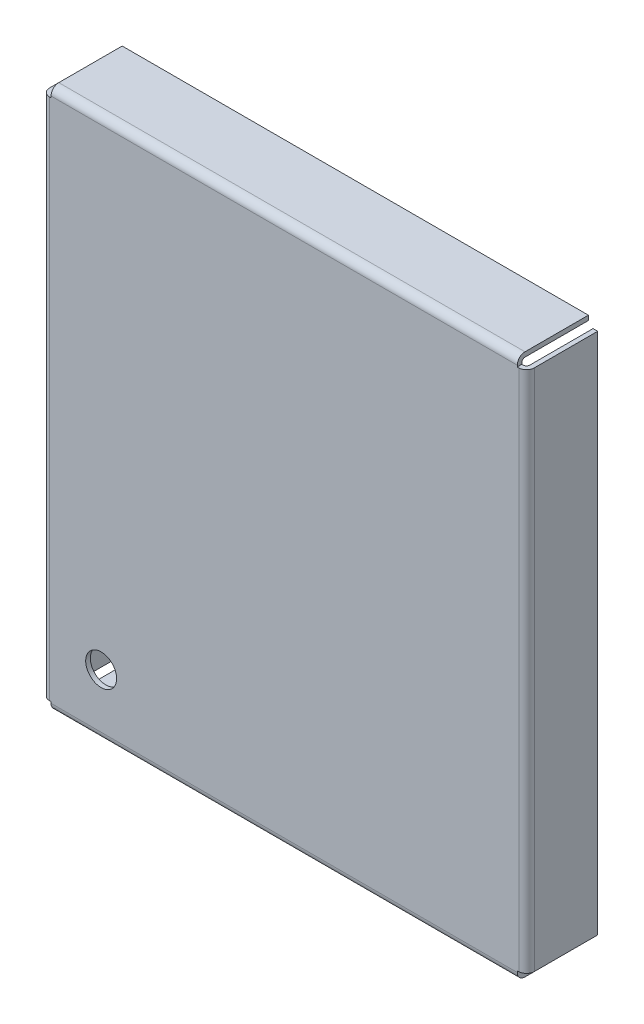
ISO-10303-21;
HEADER;
FILE_DESCRIPTION(('STEP AP214'),'2;1');
FILE_NAME('part.step','',(''),(''),'','','');
FILE_SCHEMA(('AUTOMOTIVE_DESIGN { 1 0 10303 214 1 1 1 1 }'));
ENDSEC;
DATA;
#1=APPLICATION_CONTEXT('core data for automotive mechanical design processes');
#2=APPLICATION_PROTOCOL_DEFINITION('international standard','automotive_design',2000,#1);
#3=PRODUCT_CONTEXT('',#1,'mechanical');
#4=PRODUCT('Part','Part','',(#3));
#5=PRODUCT_RELATED_PRODUCT_CATEGORY('part','',(#4));
#6=PRODUCT_DEFINITION_FORMATION('','',#4);
#7=PRODUCT_DEFINITION_CONTEXT('part definition',#1,'design');
#8=PRODUCT_DEFINITION('design','',#6,#7);
#9=PRODUCT_DEFINITION_SHAPE('','',#8);
#10=(LENGTH_UNIT() NAMED_UNIT(*) SI_UNIT(.MILLI.,.METRE.));
#11=(NAMED_UNIT(*) PLANE_ANGLE_UNIT() SI_UNIT($,.RADIAN.));
#12=(NAMED_UNIT(*) SI_UNIT($,.STERADIAN.) SOLID_ANGLE_UNIT());
#13=UNCERTAINTY_MEASURE_WITH_UNIT(LENGTH_MEASURE(1.E-05),#10,'distance_accuracy_value','');
#14=(GEOMETRIC_REPRESENTATION_CONTEXT(3) GLOBAL_UNCERTAINTY_ASSIGNED_CONTEXT((#13)) GLOBAL_UNIT_ASSIGNED_CONTEXT((#10,
#11,#12)) REPRESENTATION_CONTEXT('',''));
#15=CARTESIAN_POINT('',(0.,0.,0.));
#16=DIRECTION('',(0.,0.,1.));
#17=DIRECTION('',(1.,0.,0.));
#18=AXIS2_PLACEMENT_3D('',#15,#16,#17);
#19=CARTESIAN_POINT('',(-7.6,-8.35,0.));
#20=DIRECTION('',(-1.,0.,0.));
#21=DIRECTION('',(0.,0.,1.));
#22=AXIS2_PLACEMENT_3D('',#19,#20,#21);
#23=PLANE('',#22);
#24=DIRECTION('',(0.,0.,1.));
#25=VECTOR('',#24,1.);
#26=CARTESIAN_POINT('',(-7.6,-8.2,0.));
#27=LINE('',#26,#25);
#28=CARTESIAN_POINT('',(-7.6,-8.2,2.05));
#29=VERTEX_POINT('',#28);
#30=CARTESIAN_POINT('',(-7.6,-8.2,0.));
#31=VERTEX_POINT('',#30);
#32=EDGE_CURVE('E148',#29,#31,#27,.F.);
#33=ORIENTED_EDGE('',*,*,#32,.T.);
#34=DIRECTION('',(0.,1.,0.));
#35=VECTOR('',#34,1.);
#36=CARTESIAN_POINT('',(-7.6,0.25,0.));
#37=LINE('',#36,#35);
#38=CARTESIAN_POINT('',(-7.6,8.7,0.));
#39=VERTEX_POINT('',#38);
#40=EDGE_CURVE('E147',#31,#39,#37,.T.);
#41=ORIENTED_EDGE('',*,*,#40,.T.);
#42=DIRECTION('',(0.,0.,-1.));
#43=VECTOR('',#42,1.);
#44=CARTESIAN_POINT('',(-7.6,8.7,0.));
#45=LINE('',#44,#43);
#46=CARTESIAN_POINT('',(-7.6,8.7,2.05));
#47=VERTEX_POINT('',#46);
#48=EDGE_CURVE('E139',#39,#47,#45,.F.);
#49=ORIENTED_EDGE('',*,*,#48,.T.);
#50=DIRECTION('',(0.,1.,0.));
#51=VECTOR('',#50,1.);
#52=CARTESIAN_POINT('',(-7.6,-8.2,2.05));
#53=LINE('',#52,#51);
#54=EDGE_CURVE('E188',#47,#29,#53,.F.);
#55=ORIENTED_EDGE('',*,*,#54,.T.);
#56=EDGE_LOOP('',(#33,#41,#49,#55));
#57=FACE_BOUND('',#56,.T.);
#58=ADVANCED_FACE('F17',(#57),#23,.F.);
#59=CARTESIAN_POINT('',(7.77,-8.35,0.));
#60=DIRECTION('',(0.,-1.,0.));
#61=DIRECTION('',(0.,0.,-1.));
#62=AXIS2_PLACEMENT_3D('',#59,#60,#61);
#63=PLANE('',#62);
#64=DIRECTION('',(0.,0.,1.));
#65=VECTOR('',#64,1.);
#66=CARTESIAN_POINT('',(7.62,-8.35,0.));
#67=LINE('',#66,#65);
#68=CARTESIAN_POINT('',(7.62,-8.35,2.05));
#69=VERTEX_POINT('',#68);
#70=CARTESIAN_POINT('',(7.62,-8.35,0.));
#71=VERTEX_POINT('',#70);
#72=EDGE_CURVE('E310',#69,#71,#67,.F.);
#73=ORIENTED_EDGE('',*,*,#72,.T.);
#74=DIRECTION('',(1.,0.,0.));
#75=VECTOR('',#74,1.);
#76=CARTESIAN_POINT('',(0.085,-8.35,0.));
#77=LINE('',#76,#75);
#78=CARTESIAN_POINT('',(-7.45,-8.35,0.));
#79=VERTEX_POINT('',#78);
#80=EDGE_CURVE('E238',#71,#79,#77,.F.);
#81=ORIENTED_EDGE('',*,*,#80,.T.);
#82=DIRECTION('',(0.,0.,-1.));
#83=VECTOR('',#82,1.);
#84=CARTESIAN_POINT('',(-7.45,-8.35,0.));
#85=LINE('',#84,#83);
#86=CARTESIAN_POINT('',(-7.45,-8.35,2.05));
#87=VERTEX_POINT('',#86);
#88=EDGE_CURVE('E333',#79,#87,#85,.F.);
#89=ORIENTED_EDGE('',*,*,#88,.T.);
#90=DIRECTION('',(-1.,0.,0.));
#91=VECTOR('',#90,1.);
#92=CARTESIAN_POINT('',(7.62,-8.35,2.05));
#93=LINE('',#92,#91);
#94=EDGE_CURVE('E177',#87,#69,#93,.F.);
#95=ORIENTED_EDGE('',*,*,#94,.T.);
#96=EDGE_LOOP('',(#73,#81,#89,#95));
#97=FACE_BOUND('',#96,.T.);
#98=ADVANCED_FACE('F666',(#97),#63,.F.);
#99=CARTESIAN_POINT('',(7.77,8.85,0.));
#100=DIRECTION('',(1.,0.,0.));
#101=DIRECTION('',(0.,0.,-1.));
#102=AXIS2_PLACEMENT_3D('',#99,#100,#101);
#103=PLANE('',#102);
#104=DIRECTION('',(0.,0.,-1.));
#105=VECTOR('',#104,1.);
#106=CARTESIAN_POINT('',(7.77,8.7,0.));
#107=LINE('',#106,#105);
#108=CARTESIAN_POINT('',(7.77,8.7,2.05));
#109=VERTEX_POINT('',#108);
#110=CARTESIAN_POINT('',(7.77,8.7,0.));
#111=VERTEX_POINT('',#110);
#112=EDGE_CURVE('E359',#109,#111,#107,.T.);
#113=ORIENTED_EDGE('',*,*,#112,.T.);
#114=DIRECTION('',(0.,1.,0.));
#115=VECTOR('',#114,1.);
#116=CARTESIAN_POINT('',(7.77,0.25,0.));
#117=LINE('',#116,#115);
#118=CARTESIAN_POINT('',(7.77,-8.2,0.));
#119=VERTEX_POINT('',#118);
#120=EDGE_CURVE('E222',#111,#119,#117,.F.);
#121=ORIENTED_EDGE('',*,*,#120,.T.);
#122=DIRECTION('',(0.,0.,1.));
#123=VECTOR('',#122,1.);
#124=CARTESIAN_POINT('',(7.77,-8.2,0.));
#125=LINE('',#124,#123);
#126=CARTESIAN_POINT('',(7.77,-8.2,2.05));
#127=VERTEX_POINT('',#126);
#128=EDGE_CURVE('E382',#119,#127,#125,.T.);
#129=ORIENTED_EDGE('',*,*,#128,.T.);
#130=DIRECTION('',(0.,-1.,0.));
#131=VECTOR('',#130,1.);
#132=CARTESIAN_POINT('',(7.77,8.7,2.05));
#133=LINE('',#132,#131);
#134=EDGE_CURVE('E169',#127,#109,#133,.F.);
#135=ORIENTED_EDGE('',*,*,#134,.T.);
#136=EDGE_LOOP('',(#113,#121,#129,#135));
#137=FACE_BOUND('',#136,.T.);
#138=ADVANCED_FACE('F661',(#137),#103,.F.);
#139=CARTESIAN_POINT('',(-7.6,8.85,0.));
#140=DIRECTION('',(0.,1.,0.));
#141=DIRECTION('',(0.,0.,1.));
#142=AXIS2_PLACEMENT_3D('',#139,#140,#141);
#143=PLANE('',#142);
#144=DIRECTION('',(0.,0.,-1.));
#145=VECTOR('',#144,1.);
#146=CARTESIAN_POINT('',(-7.45,8.85,0.));
#147=LINE('',#146,#145);
#148=CARTESIAN_POINT('',(-7.45,8.85,2.05));
#149=VERTEX_POINT('',#148);
#150=CARTESIAN_POINT('',(-7.45,8.85,0.));
#151=VERTEX_POINT('',#150);
#152=EDGE_CURVE('E408',#149,#151,#147,.T.);
#153=ORIENTED_EDGE('',*,*,#152,.T.);
#154=DIRECTION('',(1.,0.,0.));
#155=VECTOR('',#154,1.);
#156=CARTESIAN_POINT('',(0.085,8.85,0.));
#157=LINE('',#156,#155);
#158=CARTESIAN_POINT('',(7.62,8.85,0.));
#159=VERTEX_POINT('',#158);
#160=EDGE_CURVE('E199',#151,#159,#157,.T.);
#161=ORIENTED_EDGE('',*,*,#160,.T.);
#162=DIRECTION('',(0.,0.,1.));
#163=VECTOR('',#162,1.);
#164=CARTESIAN_POINT('',(7.62,8.85,0.));
#165=LINE('',#164,#163);
#166=CARTESIAN_POINT('',(7.62,8.85,2.05));
#167=VERTEX_POINT('',#166);
#168=EDGE_CURVE('E429',#159,#167,#165,.T.);
#169=ORIENTED_EDGE('',*,*,#168,.T.);
#170=DIRECTION('',(1.,0.,0.));
#171=VECTOR('',#170,1.);
#172=CARTESIAN_POINT('',(-7.45,8.85,2.05));
#173=LINE('',#172,#171);
#174=EDGE_CURVE('E165',#167,#149,#173,.F.);
#175=ORIENTED_EDGE('',*,*,#174,.T.);
#176=EDGE_LOOP('',(#153,#161,#169,#175));
#177=FACE_BOUND('',#176,.T.);
#178=ADVANCED_FACE('F498',(#177),#143,.F.);
#179=CARTESIAN_POINT('',(-7.75,-8.2,0.));
#180=DIRECTION('',(0.,1.,0.));
#181=DIRECTION('',(0.,0.,1.));
#182=AXIS2_PLACEMENT_3D('',#179,#180,#181);
#183=PLANE('',#182);
#184=ORIENTED_EDGE('',*,*,#32,.F.);
#185=CARTESIAN_POINT('',(-7.5,-8.2,2.05));
#186=DIRECTION('',(0.,1.,0.));
#187=DIRECTION('',(0.,0.,1.));
#188=AXIS2_PLACEMENT_3D('',#185,#186,#187);
#189=CIRCLE('',#188,0.1);
#190=CARTESIAN_POINT('',(-7.5,-8.2,2.15));
#191=VERTEX_POINT('',#190);
#192=EDGE_CURVE('E195',#29,#191,#189,.T.);
#193=ORIENTED_EDGE('',*,*,#192,.T.);
#194=DIRECTION('',(1.,0.,0.));
#195=VECTOR('',#194,1.);
#196=CARTESIAN_POINT('',(-7.75,-8.2,2.15));
#197=LINE('',#196,#195);
#198=CARTESIAN_POINT('',(-7.45,-8.2,2.15));
#199=VERTEX_POINT('',#198);
#200=EDGE_CURVE('E155',#199,#191,#197,.F.);
#201=ORIENTED_EDGE('',*,*,#200,.F.);
#202=DIRECTION('',(0.,0.,-1.));
#203=VECTOR('',#202,1.);
#204=CARTESIAN_POINT('',(-7.45,-8.2,0.));
#205=LINE('',#204,#203);
#206=CARTESIAN_POINT('',(-7.45,-8.2,2.3));
#207=VERTEX_POINT('',#206);
#208=EDGE_CURVE('E232',#199,#207,#205,.F.);
#209=ORIENTED_EDGE('',*,*,#208,.T.);
#210=DIRECTION('',(1.,0.,0.));
#211=VECTOR('',#210,1.);
#212=CARTESIAN_POINT('',(-7.75,-8.2,2.3));
#213=LINE('',#212,#211);
#214=CARTESIAN_POINT('',(-7.5,-8.2,2.3));
#215=VERTEX_POINT('',#214);
#216=EDGE_CURVE('E99',#215,#207,#213,.T.);
#217=ORIENTED_EDGE('',*,*,#216,.F.);
#218=CARTESIAN_POINT('',(-7.5,-8.2,2.05));
#219=DIRECTION('',(0.,-1.,0.));
#220=DIRECTION('',(0.,0.,-1.));
#221=AXIS2_PLACEMENT_3D('',#218,#219,#220);
#222=CIRCLE('',#221,0.25);
#223=CARTESIAN_POINT('',(-7.75,-8.2,2.05));
#224=VERTEX_POINT('',#223);
#225=EDGE_CURVE('E20',#224,#215,#222,.F.);
#226=ORIENTED_EDGE('',*,*,#225,.F.);
#227=DIRECTION('',(0.,0.,-1.));
#228=VECTOR('',#227,1.);
#229=CARTESIAN_POINT('',(-7.75,-8.2,0.));
#230=LINE('',#229,#228);
#231=CARTESIAN_POINT('',(-7.75,-8.2,0.));
#232=VERTEX_POINT('',#231);
#233=EDGE_CURVE('E95',#224,#232,#230,.T.);
#234=ORIENTED_EDGE('',*,*,#233,.T.);
#235=DIRECTION('',(1.,0.,0.));
#236=VECTOR('',#235,1.);
#237=CARTESIAN_POINT('',(0.085,-8.2,0.));
#238=LINE('',#237,#236);
#239=EDGE_CURVE('E145',#232,#31,#238,.T.);
#240=ORIENTED_EDGE('',*,*,#239,.T.);
#241=EDGE_LOOP('',(#184,#193,#201,#209,#217,#226,#234,#240));
#242=FACE_BOUND('',#241,.T.);
#243=ADVANCED_FACE('F92',(#242),#183,.F.);
#244=CARTESIAN_POINT('',(0.085,0.25,0.));
#245=DIRECTION('',(0.,0.,1.));
#246=DIRECTION('',(1.,0.,0.));
#247=AXIS2_PLACEMENT_3D('',#244,#245,#246);
#248=PLANE('',#247);
#249=ORIENTED_EDGE('',*,*,#239,.F.);
#250=DIRECTION('',(0.,1.,0.));
#251=VECTOR('',#250,1.);
#252=CARTESIAN_POINT('',(-7.75,9.,0.));
#253=LINE('',#252,#251);
#254=CARTESIAN_POINT('',(-7.75,8.7,0.));
#255=VERTEX_POINT('',#254);
#256=EDGE_CURVE('E111',#232,#255,#253,.T.);
#257=ORIENTED_EDGE('',*,*,#256,.T.);
#258=DIRECTION('',(1.,0.,0.));
#259=VECTOR('',#258,1.);
#260=CARTESIAN_POINT('',(-7.45,8.7,0.));
#261=LINE('',#260,#259);
#262=EDGE_CURVE('E136',#255,#39,#261,.T.);
#263=ORIENTED_EDGE('',*,*,#262,.T.);
#264=ORIENTED_EDGE('',*,*,#40,.F.);
#265=EDGE_LOOP('',(#249,#257,#263,#264));
#266=FACE_BOUND('',#265,.T.);
#267=ADVANCED_FACE('F679',(#266),#248,.F.);
#268=CARTESIAN_POINT('',(-7.45,8.7,0.));
#269=DIRECTION('',(0.,-1.,0.));
#270=DIRECTION('',(0.,0.,-1.));
#271=AXIS2_PLACEMENT_3D('',#268,#269,#270);
#272=PLANE('',#271);
#273=DIRECTION('',(1.,0.,0.));
#274=VECTOR('',#273,1.);
#275=CARTESIAN_POINT('',(-7.45,8.7,2.15));
#276=LINE('',#275,#274);
#277=CARTESIAN_POINT('',(-7.5,8.7,2.15));
#278=VERTEX_POINT('',#277);
#279=CARTESIAN_POINT('',(-7.45,8.7,2.15));
#280=VERTEX_POINT('',#279);
#281=EDGE_CURVE('E288',#278,#280,#276,.T.);
#282=ORIENTED_EDGE('',*,*,#281,.F.);
#283=CARTESIAN_POINT('',(-7.5,8.7,2.05));
#284=DIRECTION('',(0.,1.,0.));
#285=DIRECTION('',(0.,0.,1.));
#286=AXIS2_PLACEMENT_3D('',#283,#284,#285);
#287=CIRCLE('',#286,0.1);
#288=EDGE_CURVE('E191',#278,#47,#287,.F.);
#289=ORIENTED_EDGE('',*,*,#288,.T.);
#290=ORIENTED_EDGE('',*,*,#48,.F.);
#291=ORIENTED_EDGE('',*,*,#262,.F.);
#292=DIRECTION('',(0.,0.,-1.));
#293=VECTOR('',#292,1.);
#294=CARTESIAN_POINT('',(-7.75,8.7,0.));
#295=LINE('',#294,#293);
#296=CARTESIAN_POINT('',(-7.75,8.7,2.05));
#297=VERTEX_POINT('',#296);
#298=EDGE_CURVE('E131',#255,#297,#295,.F.);
#299=ORIENTED_EDGE('',*,*,#298,.T.);
#300=CARTESIAN_POINT('',(-7.5,8.7,2.05));
#301=DIRECTION('',(0.,-1.,0.));
#302=DIRECTION('',(0.,0.,-1.));
#303=AXIS2_PLACEMENT_3D('',#300,#301,#302);
#304=CIRCLE('',#303,0.25);
#305=CARTESIAN_POINT('',(-7.5,8.7,2.3));
#306=VERTEX_POINT('',#305);
#307=EDGE_CURVE('E116',#306,#297,#304,.T.);
#308=ORIENTED_EDGE('',*,*,#307,.F.);
#309=DIRECTION('',(1.,0.,0.));
#310=VECTOR('',#309,1.);
#311=CARTESIAN_POINT('',(-7.45,8.7,2.3));
#312=LINE('',#311,#310);
#313=CARTESIAN_POINT('',(-7.45,8.7,2.3));
#314=VERTEX_POINT('',#313);
#315=EDGE_CURVE('E250',#314,#306,#312,.F.);
#316=ORIENTED_EDGE('',*,*,#315,.F.);
#317=DIRECTION('',(0.,0.,-1.));
#318=VECTOR('',#317,1.);
#319=CARTESIAN_POINT('',(-7.45,8.7,0.));
#320=LINE('',#319,#318);
#321=EDGE_CURVE('E209',#314,#280,#320,.T.);
#322=ORIENTED_EDGE('',*,*,#321,.T.);
#323=EDGE_LOOP('',(#282,#289,#290,#291,#299,#308,#316,#322));
#324=FACE_BOUND('',#323,.T.);
#325=ADVANCED_FACE('F565',(#324),#272,.F.);
#326=CARTESIAN_POINT('',(7.62,-8.5,0.));
#327=DIRECTION('',(-1.,0.,0.));
#328=DIRECTION('',(0.,0.,1.));
#329=AXIS2_PLACEMENT_3D('',#326,#327,#328);
#330=PLANE('',#329);
#331=ORIENTED_EDGE('',*,*,#72,.F.);
#332=CARTESIAN_POINT('',(7.62,-8.25,2.05));
#333=DIRECTION('',(-1.,0.,0.));
#334=DIRECTION('',(0.,0.,1.));
#335=AXIS2_PLACEMENT_3D('',#332,#333,#334);
#336=CIRCLE('',#335,0.1);
#337=CARTESIAN_POINT('',(7.62,-8.25,2.15));
#338=VERTEX_POINT('',#337);
#339=EDGE_CURVE('E180',#69,#338,#336,.T.);
#340=ORIENTED_EDGE('',*,*,#339,.T.);
#341=DIRECTION('',(0.,1.,0.));
#342=VECTOR('',#341,1.);
#343=CARTESIAN_POINT('',(7.62,-8.5,2.15));
#344=LINE('',#343,#342);
#345=CARTESIAN_POINT('',(7.62,-8.2,2.15));
#346=VERTEX_POINT('',#345);
#347=EDGE_CURVE('E305',#346,#338,#344,.F.);
#348=ORIENTED_EDGE('',*,*,#347,.F.);
#349=DIRECTION('',(0.,0.,1.));
#350=VECTOR('',#349,1.);
#351=CARTESIAN_POINT('',(7.62,-8.2,0.));
#352=LINE('',#351,#350);
#353=CARTESIAN_POINT('',(7.62,-8.2,2.3));
#354=VERTEX_POINT('',#353);
#355=EDGE_CURVE('E216',#346,#354,#352,.T.);
#356=ORIENTED_EDGE('',*,*,#355,.T.);
#357=DIRECTION('',(0.,1.,0.));
#358=VECTOR('',#357,1.);
#359=CARTESIAN_POINT('',(7.62,-8.5,2.3));
#360=LINE('',#359,#358);
#361=CARTESIAN_POINT('',(7.62,-8.25,2.3));
#362=VERTEX_POINT('',#361);
#363=EDGE_CURVE('E287',#362,#354,#360,.T.);
#364=ORIENTED_EDGE('',*,*,#363,.F.);
#365=CARTESIAN_POINT('',(7.62,-8.25,2.05));
#366=DIRECTION('',(1.,0.,0.));
#367=DIRECTION('',(0.,0.,-1.));
#368=AXIS2_PLACEMENT_3D('',#365,#366,#367);
#369=CIRCLE('',#368,0.25);
#370=CARTESIAN_POINT('',(7.62,-8.5,2.05));
#371=VERTEX_POINT('',#370);
#372=EDGE_CURVE('E286',#371,#362,#369,.F.);
#373=ORIENTED_EDGE('',*,*,#372,.F.);
#374=DIRECTION('',(0.,0.,1.));
#375=VECTOR('',#374,1.);
#376=CARTESIAN_POINT('',(7.62,-8.5,0.));
#377=LINE('',#376,#375);
#378=CARTESIAN_POINT('',(7.62,-8.5,0.));
#379=VERTEX_POINT('',#378);
#380=EDGE_CURVE('E133',#371,#379,#377,.F.);
#381=ORIENTED_EDGE('',*,*,#380,.T.);
#382=DIRECTION('',(0.,1.,0.));
#383=VECTOR('',#382,1.);
#384=CARTESIAN_POINT('',(7.62,0.25,0.));
#385=LINE('',#384,#383);
#386=EDGE_CURVE('E242',#379,#71,#385,.T.);
#387=ORIENTED_EDGE('',*,*,#386,.T.);
#388=EDGE_LOOP('',(#331,#340,#348,#356,#364,#373,#381,#387));
#389=FACE_BOUND('',#388,.T.);
#390=ADVANCED_FACE('F637',(#389),#330,.F.);
#391=CARTESIAN_POINT('',(0.085,0.25,0.));
#392=DIRECTION('',(0.,0.,1.));
#393=DIRECTION('',(1.,0.,0.));
#394=AXIS2_PLACEMENT_3D('',#391,#392,#393);
#395=PLANE('',#394);
#396=ORIENTED_EDGE('',*,*,#386,.F.);
#397=DIRECTION('',(1.,0.,0.));
#398=VECTOR('',#397,1.);
#399=CARTESIAN_POINT('',(-7.75,-8.5,0.));
#400=LINE('',#399,#398);
#401=CARTESIAN_POINT('',(-7.45,-8.5,0.));
#402=VERTEX_POINT('',#401);
#403=EDGE_CURVE('E319',#379,#402,#400,.F.);
#404=ORIENTED_EDGE('',*,*,#403,.T.);
#405=DIRECTION('',(0.,1.,0.));
#406=VECTOR('',#405,1.);
#407=CARTESIAN_POINT('',(-7.45,-8.2,0.));
#408=LINE('',#407,#406);
#409=EDGE_CURVE('E285',#402,#79,#408,.T.);
#410=ORIENTED_EDGE('',*,*,#409,.T.);
#411=ORIENTED_EDGE('',*,*,#80,.F.);
#412=EDGE_LOOP('',(#396,#404,#410,#411));
#413=FACE_BOUND('',#412,.T.);
#414=ADVANCED_FACE('F634',(#413),#395,.F.);
#415=CARTESIAN_POINT('',(-7.45,-8.2,0.));
#416=DIRECTION('',(1.,0.,0.));
#417=DIRECTION('',(0.,0.,-1.));
#418=AXIS2_PLACEMENT_3D('',#415,#416,#417);
#419=PLANE('',#418);
#420=DIRECTION('',(0.,1.,0.));
#421=VECTOR('',#420,1.);
#422=CARTESIAN_POINT('',(-7.45,-8.2,2.15));
#423=LINE('',#422,#421);
#424=CARTESIAN_POINT('',(-7.45,-8.25,2.15));
#425=VERTEX_POINT('',#424);
#426=EDGE_CURVE('E235',#425,#199,#423,.T.);
#427=ORIENTED_EDGE('',*,*,#426,.F.);
#428=CARTESIAN_POINT('',(-7.45,-8.25,2.05));
#429=DIRECTION('',(-1.,0.,0.));
#430=DIRECTION('',(0.,0.,1.));
#431=AXIS2_PLACEMENT_3D('',#428,#429,#430);
#432=CIRCLE('',#431,0.1);
#433=EDGE_CURVE('E181',#425,#87,#432,.F.);
#434=ORIENTED_EDGE('',*,*,#433,.T.);
#435=ORIENTED_EDGE('',*,*,#88,.F.);
#436=ORIENTED_EDGE('',*,*,#409,.F.);
#437=DIRECTION('',(0.,0.,1.));
#438=VECTOR('',#437,1.);
#439=CARTESIAN_POINT('',(-7.45,-8.5,0.));
#440=LINE('',#439,#438);
#441=CARTESIAN_POINT('',(-7.45,-8.5,2.05));
#442=VERTEX_POINT('',#441);
#443=EDGE_CURVE('E328',#402,#442,#440,.T.);
#444=ORIENTED_EDGE('',*,*,#443,.T.);
#445=CARTESIAN_POINT('',(-7.45,-8.25,2.05));
#446=DIRECTION('',(1.,0.,0.));
#447=DIRECTION('',(0.,0.,-1.));
#448=AXIS2_PLACEMENT_3D('',#445,#446,#447);
#449=CIRCLE('',#448,0.25);
#450=CARTESIAN_POINT('',(-7.45,-8.25,2.3));
#451=VERTEX_POINT('',#450);
#452=EDGE_CURVE('E283',#451,#442,#449,.T.);
#453=ORIENTED_EDGE('',*,*,#452,.F.);
#454=DIRECTION('',(0.,1.,0.));
#455=VECTOR('',#454,1.);
#456=CARTESIAN_POINT('',(-7.45,-8.2,2.3));
#457=LINE('',#456,#455);
#458=EDGE_CURVE('E241',#207,#451,#457,.F.);
#459=ORIENTED_EDGE('',*,*,#458,.F.);
#460=ORIENTED_EDGE('',*,*,#208,.F.);
#461=EDGE_LOOP('',(#427,#434,#435,#436,#444,#453,#459,#460));
#462=FACE_BOUND('',#461,.T.);
#463=ADVANCED_FACE('F628',(#462),#419,.F.);
#464=CARTESIAN_POINT('',(7.92,8.7,0.));
#465=DIRECTION('',(0.,-1.,0.));
#466=DIRECTION('',(0.,0.,-1.));
#467=AXIS2_PLACEMENT_3D('',#464,#465,#466);
#468=PLANE('',#467);
#469=ORIENTED_EDGE('',*,*,#112,.F.);
#470=CARTESIAN_POINT('',(7.67,8.7,2.05));
#471=DIRECTION('',(0.,-1.,0.));
#472=DIRECTION('',(0.,0.,-1.));
#473=AXIS2_PLACEMENT_3D('',#470,#471,#472);
#474=CIRCLE('',#473,0.1);
#475=CARTESIAN_POINT('',(7.67,8.7,2.15));
#476=VERTEX_POINT('',#475);
#477=EDGE_CURVE('E172',#109,#476,#474,.T.);
#478=ORIENTED_EDGE('',*,*,#477,.T.);
#479=DIRECTION('',(1.,0.,0.));
#480=VECTOR('',#479,1.);
#481=CARTESIAN_POINT('',(7.92,8.7,2.15));
#482=LINE('',#481,#480);
#483=CARTESIAN_POINT('',(7.62,8.7,2.15));
#484=VERTEX_POINT('',#483);
#485=EDGE_CURVE('E354',#484,#476,#482,.T.);
#486=ORIENTED_EDGE('',*,*,#485,.F.);
#487=DIRECTION('',(0.,0.,1.));
#488=VECTOR('',#487,1.);
#489=CARTESIAN_POINT('',(7.62,8.7,0.));
#490=LINE('',#489,#488);
#491=CARTESIAN_POINT('',(7.62,8.7,2.3));
#492=VERTEX_POINT('',#491);
#493=EDGE_CURVE('E192',#484,#492,#490,.T.);
#494=ORIENTED_EDGE('',*,*,#493,.T.);
#495=DIRECTION('',(1.,0.,0.));
#496=VECTOR('',#495,1.);
#497=CARTESIAN_POINT('',(7.92,8.7,2.3));
#498=LINE('',#497,#496);
#499=CARTESIAN_POINT('',(7.67,8.7,2.3));
#500=VERTEX_POINT('',#499);
#501=EDGE_CURVE('E282',#500,#492,#498,.F.);
#502=ORIENTED_EDGE('',*,*,#501,.F.);
#503=CARTESIAN_POINT('',(7.67,8.7,2.05));
#504=DIRECTION('',(0.,1.,0.));
#505=DIRECTION('',(0.,0.,1.));
#506=AXIS2_PLACEMENT_3D('',#503,#504,#505);
#507=CIRCLE('',#506,0.25);
#508=CARTESIAN_POINT('',(7.92,8.7,2.05));
#509=VERTEX_POINT('',#508);
#510=EDGE_CURVE('E234',#509,#500,#507,.F.);
#511=ORIENTED_EDGE('',*,*,#510,.F.);
#512=DIRECTION('',(0.,0.,1.));
#513=VECTOR('',#512,1.);
#514=CARTESIAN_POINT('',(7.92,8.7,0.));
#515=LINE('',#514,#513);
#516=CARTESIAN_POINT('',(7.92,8.7,0.));
#517=VERTEX_POINT('',#516);
#518=EDGE_CURVE('E337',#509,#517,#515,.F.);
#519=ORIENTED_EDGE('',*,*,#518,.T.);
#520=DIRECTION('',(1.,0.,0.));
#521=VECTOR('',#520,1.);
#522=CARTESIAN_POINT('',(0.085,8.7,0.));
#523=LINE('',#522,#521);
#524=EDGE_CURVE('E226',#517,#111,#523,.F.);
#525=ORIENTED_EDGE('',*,*,#524,.T.);
#526=EDGE_LOOP('',(#469,#478,#486,#494,#502,#511,#519,#525));
#527=FACE_BOUND('',#526,.T.);
#528=ADVANCED_FACE('F464',(#527),#468,.F.);
#529=CARTESIAN_POINT('',(0.085,0.25,0.));
#530=DIRECTION('',(0.,0.,1.));
#531=DIRECTION('',(1.,0.,0.));
#532=AXIS2_PLACEMENT_3D('',#529,#530,#531);
#533=PLANE('',#532);
#534=ORIENTED_EDGE('',*,*,#120,.F.);
#535=ORIENTED_EDGE('',*,*,#524,.F.);
#536=DIRECTION('',(0.,1.,0.));
#537=VECTOR('',#536,1.);
#538=CARTESIAN_POINT('',(7.92,-8.5,0.));
#539=LINE('',#538,#537);
#540=CARTESIAN_POINT('',(7.92,-8.2,0.));
#541=VERTEX_POINT('',#540);
#542=EDGE_CURVE('E368',#517,#541,#539,.F.);
#543=ORIENTED_EDGE('',*,*,#542,.T.);
#544=DIRECTION('',(1.,0.,0.));
#545=VECTOR('',#544,1.);
#546=CARTESIAN_POINT('',(7.62,-8.2,0.));
#547=LINE('',#546,#545);
#548=EDGE_CURVE('E280',#541,#119,#547,.F.);
#549=ORIENTED_EDGE('',*,*,#548,.T.);
#550=EDGE_LOOP('',(#534,#535,#543,#549));
#551=FACE_BOUND('',#550,.T.);
#552=ADVANCED_FACE('F656',(#551),#533,.F.);
#553=CARTESIAN_POINT('',(7.62,-8.2,0.));
#554=DIRECTION('',(0.,1.,0.));
#555=DIRECTION('',(0.,0.,1.));
#556=AXIS2_PLACEMENT_3D('',#553,#554,#555);
#557=PLANE('',#556);
#558=DIRECTION('',(1.,0.,0.));
#559=VECTOR('',#558,1.);
#560=CARTESIAN_POINT('',(7.62,-8.2,2.15));
#561=LINE('',#560,#559);
#562=CARTESIAN_POINT('',(7.67,-8.2,2.15));
#563=VERTEX_POINT('',#562);
#564=EDGE_CURVE('E219',#563,#346,#561,.F.);
#565=ORIENTED_EDGE('',*,*,#564,.F.);
#566=CARTESIAN_POINT('',(7.67,-8.2,2.05));
#567=DIRECTION('',(0.,-1.,0.));
#568=DIRECTION('',(0.,0.,-1.));
#569=AXIS2_PLACEMENT_3D('',#566,#567,#568);
#570=CIRCLE('',#569,0.1);
#571=EDGE_CURVE('E173',#563,#127,#570,.F.);
#572=ORIENTED_EDGE('',*,*,#571,.T.);
#573=ORIENTED_EDGE('',*,*,#128,.F.);
#574=ORIENTED_EDGE('',*,*,#548,.F.);
#575=DIRECTION('',(0.,0.,1.));
#576=VECTOR('',#575,1.);
#577=CARTESIAN_POINT('',(7.92,-8.2,0.));
#578=LINE('',#577,#576);
#579=CARTESIAN_POINT('',(7.92,-8.2,2.05));
#580=VERTEX_POINT('',#579);
#581=EDGE_CURVE('E377',#541,#580,#578,.T.);
#582=ORIENTED_EDGE('',*,*,#581,.T.);
#583=CARTESIAN_POINT('',(7.67,-8.2,2.05));
#584=DIRECTION('',(0.,1.,0.));
#585=DIRECTION('',(0.,0.,1.));
#586=AXIS2_PLACEMENT_3D('',#583,#584,#585);
#587=CIRCLE('',#586,0.25);
#588=CARTESIAN_POINT('',(7.67,-8.2,2.3));
#589=VERTEX_POINT('',#588);
#590=EDGE_CURVE('E278',#589,#580,#587,.T.);
#591=ORIENTED_EDGE('',*,*,#590,.F.);
#592=DIRECTION('',(1.,0.,0.));
#593=VECTOR('',#592,1.);
#594=CARTESIAN_POINT('',(7.62,-8.2,2.3));
#595=LINE('',#594,#593);
#596=EDGE_CURVE('E225',#354,#589,#595,.T.);
#597=ORIENTED_EDGE('',*,*,#596,.F.);
#598=ORIENTED_EDGE('',*,*,#355,.F.);
#599=EDGE_LOOP('',(#565,#572,#573,#574,#582,#591,#597,#598));
#600=FACE_BOUND('',#599,.T.);
#601=ADVANCED_FACE('F646',(#600),#557,.F.);
#602=CARTESIAN_POINT('',(-7.45,9.,0.));
#603=DIRECTION('',(1.,0.,0.));
#604=DIRECTION('',(0.,0.,-1.));
#605=AXIS2_PLACEMENT_3D('',#602,#603,#604);
#606=PLANE('',#605);
#607=ORIENTED_EDGE('',*,*,#152,.F.);
#608=CARTESIAN_POINT('',(-7.45,8.75,2.05));
#609=DIRECTION('',(1.,0.,0.));
#610=DIRECTION('',(0.,0.,-1.));
#611=AXIS2_PLACEMENT_3D('',#608,#609,#610);
#612=CIRCLE('',#611,0.1);
#613=CARTESIAN_POINT('',(-7.45,8.75,2.15));
#614=VERTEX_POINT('',#613);
#615=EDGE_CURVE('E112',#149,#614,#612,.T.);
#616=ORIENTED_EDGE('',*,*,#615,.T.);
#617=DIRECTION('',(0.,1.,0.));
#618=VECTOR('',#617,1.);
#619=CARTESIAN_POINT('',(-7.45,9.,2.15));
#620=LINE('',#619,#618);
#621=EDGE_CURVE('E212',#280,#614,#620,.T.);
#622=ORIENTED_EDGE('',*,*,#621,.F.);
#623=ORIENTED_EDGE('',*,*,#321,.F.);
#624=DIRECTION('',(0.,1.,0.));
#625=VECTOR('',#624,1.);
#626=CARTESIAN_POINT('',(-7.45,9.,2.3));
#627=LINE('',#626,#625);
#628=CARTESIAN_POINT('',(-7.45,8.75,2.3));
#629=VERTEX_POINT('',#628);
#630=EDGE_CURVE('E213',#629,#314,#627,.F.);
#631=ORIENTED_EDGE('',*,*,#630,.F.);
#632=CARTESIAN_POINT('',(-7.45,8.75,2.05));
#633=DIRECTION('',(-1.,0.,0.));
#634=DIRECTION('',(0.,0.,1.));
#635=AXIS2_PLACEMENT_3D('',#632,#633,#634);
#636=CIRCLE('',#635,0.25);
#637=CARTESIAN_POINT('',(-7.45,9.,2.05));
#638=VERTEX_POINT('',#637);
#639=EDGE_CURVE('E35',#638,#629,#636,.F.);
#640=ORIENTED_EDGE('',*,*,#639,.F.);
#641=DIRECTION('',(0.,0.,-1.));
#642=VECTOR('',#641,1.);
#643=CARTESIAN_POINT('',(-7.45,9.,0.));
#644=LINE('',#643,#642);
#645=CARTESIAN_POINT('',(-7.45,9.,0.));
#646=VERTEX_POINT('',#645);
#647=EDGE_CURVE('E387',#638,#646,#644,.T.);
#648=ORIENTED_EDGE('',*,*,#647,.T.);
#649=DIRECTION('',(0.,1.,0.));
#650=VECTOR('',#649,1.);
#651=CARTESIAN_POINT('',(-7.45,0.25,0.));
#652=LINE('',#651,#650);
#653=EDGE_CURVE('E203',#646,#151,#652,.F.);
#654=ORIENTED_EDGE('',*,*,#653,.T.);
#655=EDGE_LOOP('',(#607,#616,#622,#623,#631,#640,#648,#654));
#656=FACE_BOUND('',#655,.T.);
#657=ADVANCED_FACE('F487',(#656),#606,.F.);
#658=CARTESIAN_POINT('',(0.085,0.25,0.));
#659=DIRECTION('',(0.,0.,1.));
#660=DIRECTION('',(1.,0.,0.));
#661=AXIS2_PLACEMENT_3D('',#658,#659,#660);
#662=PLANE('',#661);
#663=ORIENTED_EDGE('',*,*,#160,.F.);
#664=ORIENTED_EDGE('',*,*,#653,.F.);
#665=DIRECTION('',(1.,0.,0.));
#666=VECTOR('',#665,1.);
#667=CARTESIAN_POINT('',(7.92,9.,0.));
#668=LINE('',#667,#666);
#669=CARTESIAN_POINT('',(7.62,9.,0.));
#670=VERTEX_POINT('',#669);
#671=EDGE_CURVE('E416',#646,#670,#668,.T.);
#672=ORIENTED_EDGE('',*,*,#671,.T.);
#673=DIRECTION('',(0.,1.,0.));
#674=VECTOR('',#673,1.);
#675=CARTESIAN_POINT('',(7.62,8.7,0.));
#676=LINE('',#675,#674);
#677=EDGE_CURVE('E276',#670,#159,#676,.F.);
#678=ORIENTED_EDGE('',*,*,#677,.T.);
#679=EDGE_LOOP('',(#663,#664,#672,#678));
#680=FACE_BOUND('',#679,.T.);
#681=ADVANCED_FACE('F492',(#680),#662,.F.);
#682=CARTESIAN_POINT('',(7.62,8.7,0.));
#683=DIRECTION('',(-1.,0.,0.));
#684=DIRECTION('',(0.,0.,1.));
#685=AXIS2_PLACEMENT_3D('',#682,#683,#684);
#686=PLANE('',#685);
#687=DIRECTION('',(0.,1.,0.));
#688=VECTOR('',#687,1.);
#689=CARTESIAN_POINT('',(7.62,8.7,2.15));
#690=LINE('',#689,#688);
#691=CARTESIAN_POINT('',(7.62,8.75,2.15));
#692=VERTEX_POINT('',#691);
#693=EDGE_CURVE('E196',#692,#484,#690,.F.);
#694=ORIENTED_EDGE('',*,*,#693,.F.);
#695=CARTESIAN_POINT('',(7.62,8.75,2.05));
#696=DIRECTION('',(1.,0.,0.));
#697=DIRECTION('',(0.,0.,-1.));
#698=AXIS2_PLACEMENT_3D('',#695,#696,#697);
#699=CIRCLE('',#698,0.1);
#700=EDGE_CURVE('E167',#692,#167,#699,.F.);
#701=ORIENTED_EDGE('',*,*,#700,.T.);
#702=ORIENTED_EDGE('',*,*,#168,.F.);
#703=ORIENTED_EDGE('',*,*,#677,.F.);
#704=DIRECTION('',(0.,0.,-1.));
#705=VECTOR('',#704,1.);
#706=CARTESIAN_POINT('',(7.62,9.,0.));
#707=LINE('',#706,#705);
#708=CARTESIAN_POINT('',(7.62,9.,2.05));
#709=VERTEX_POINT('',#708);
#710=EDGE_CURVE('E187',#670,#709,#707,.F.);
#711=ORIENTED_EDGE('',*,*,#710,.T.);
#712=CARTESIAN_POINT('',(7.62,8.75,2.05));
#713=DIRECTION('',(-1.,0.,0.));
#714=DIRECTION('',(0.,0.,1.));
#715=AXIS2_PLACEMENT_3D('',#712,#713,#714);
#716=CIRCLE('',#715,0.25);
#717=CARTESIAN_POINT('',(7.62,8.75,2.3));
#718=VERTEX_POINT('',#717);
#719=EDGE_CURVE('E274',#718,#709,#716,.T.);
#720=ORIENTED_EDGE('',*,*,#719,.F.);
#721=DIRECTION('',(0.,1.,0.));
#722=VECTOR('',#721,1.);
#723=CARTESIAN_POINT('',(7.62,8.7,2.3));
#724=LINE('',#723,#722);
#725=EDGE_CURVE('E202',#492,#718,#724,.T.);
#726=ORIENTED_EDGE('',*,*,#725,.F.);
#727=ORIENTED_EDGE('',*,*,#493,.F.);
#728=EDGE_LOOP('',(#694,#701,#702,#703,#711,#720,#726,#727));
#729=FACE_BOUND('',#728,.T.);
#730=ADVANCED_FACE('F469',(#729),#686,.F.);
#731=CARTESIAN_POINT('',(-7.5,-8.2,2.05));
#732=DIRECTION('',(0.,1.,0.));
#733=DIRECTION('',(0.,0.,1.));
#734=AXIS2_PLACEMENT_3D('',#731,#732,#733);
#735=CYLINDRICAL_SURFACE('',#734,0.1);
#736=ORIENTED_EDGE('',*,*,#288,.F.);
#737=DIRECTION('',(0.,1.,0.));
#738=VECTOR('',#737,1.);
#739=CARTESIAN_POINT('',(-7.5,0.25,2.15));
#740=LINE('',#739,#738);
#741=EDGE_CURVE('E184',#278,#191,#740,.F.);
#742=ORIENTED_EDGE('',*,*,#741,.T.);
#743=ORIENTED_EDGE('',*,*,#192,.F.);
#744=ORIENTED_EDGE('',*,*,#54,.F.);
#745=EDGE_LOOP('',(#736,#742,#743,#744));
#746=FACE_BOUND('',#745,.T.);
#747=ADVANCED_FACE('F562',(#746),#735,.F.);
#748=CARTESIAN_POINT('',(7.62,-8.25,2.05));
#749=DIRECTION('',(-1.,0.,0.));
#750=DIRECTION('',(0.,0.,1.));
#751=AXIS2_PLACEMENT_3D('',#748,#749,#750);
#752=CYLINDRICAL_SURFACE('',#751,0.1);
#753=ORIENTED_EDGE('',*,*,#94,.F.);
#754=ORIENTED_EDGE('',*,*,#433,.F.);
#755=DIRECTION('',(1.,0.,0.));
#756=VECTOR('',#755,1.);
#757=CARTESIAN_POINT('',(0.085,-8.25,2.15));
#758=LINE('',#757,#756);
#759=EDGE_CURVE('E176',#425,#338,#758,.T.);
#760=ORIENTED_EDGE('',*,*,#759,.T.);
#761=ORIENTED_EDGE('',*,*,#339,.F.);
#762=EDGE_LOOP('',(#753,#754,#760,#761));
#763=FACE_BOUND('',#762,.T.);
#764=ADVANCED_FACE('F583',(#763),#752,.F.);
#765=CARTESIAN_POINT('',(7.67,8.7,2.05));
#766=DIRECTION('',(0.,-1.,0.));
#767=DIRECTION('',(0.,0.,-1.));
#768=AXIS2_PLACEMENT_3D('',#765,#766,#767);
#769=CYLINDRICAL_SURFACE('',#768,0.1);
#770=ORIENTED_EDGE('',*,*,#134,.F.);
#771=ORIENTED_EDGE('',*,*,#571,.F.);
#772=DIRECTION('',(0.,1.,0.));
#773=VECTOR('',#772,1.);
#774=CARTESIAN_POINT('',(7.67,0.25,2.15));
#775=LINE('',#774,#773);
#776=EDGE_CURVE('E125',#563,#476,#775,.T.);
#777=ORIENTED_EDGE('',*,*,#776,.T.);
#778=ORIENTED_EDGE('',*,*,#477,.F.);
#779=EDGE_LOOP('',(#770,#771,#777,#778));
#780=FACE_BOUND('',#779,.T.);
#781=ADVANCED_FACE('F574',(#780),#769,.F.);
#782=CARTESIAN_POINT('',(-7.45,8.75,2.05));
#783=DIRECTION('',(1.,0.,0.));
#784=DIRECTION('',(0.,0.,-1.));
#785=AXIS2_PLACEMENT_3D('',#782,#783,#784);
#786=CYLINDRICAL_SURFACE('',#785,0.1);
#787=ORIENTED_EDGE('',*,*,#174,.F.);
#788=ORIENTED_EDGE('',*,*,#700,.F.);
#789=DIRECTION('',(1.,0.,0.));
#790=VECTOR('',#789,1.);
#791=CARTESIAN_POINT('',(0.085,8.75,2.15));
#792=LINE('',#791,#790);
#793=EDGE_CURVE('E119',#692,#614,#792,.F.);
#794=ORIENTED_EDGE('',*,*,#793,.T.);
#795=ORIENTED_EDGE('',*,*,#615,.F.);
#796=EDGE_LOOP('',(#787,#788,#794,#795));
#797=FACE_BOUND('',#796,.T.);
#798=ADVANCED_FACE('F572',(#797),#786,.F.);
#799=CARTESIAN_POINT('',(-7.75,9.,0.));
#800=DIRECTION('',(1.,0.,0.));
#801=DIRECTION('',(0.,0.,-1.));
#802=AXIS2_PLACEMENT_3D('',#799,#800,#801);
#803=PLANE('',#802);
#804=ORIENTED_EDGE('',*,*,#298,.F.);
#805=ORIENTED_EDGE('',*,*,#256,.F.);
#806=ORIENTED_EDGE('',*,*,#233,.F.);
#807=DIRECTION('',(0.,-1.,0.));
#808=VECTOR('',#807,1.);
#809=CARTESIAN_POINT('',(-7.75,8.7,2.05));
#810=LINE('',#809,#808);
#811=EDGE_CURVE('E109',#297,#224,#810,.T.);
#812=ORIENTED_EDGE('',*,*,#811,.F.);
#813=EDGE_LOOP('',(#804,#805,#806,#812));
#814=FACE_BOUND('',#813,.T.);
#815=ADVANCED_FACE('F108',(#814),#803,.F.);
#816=CARTESIAN_POINT('',(-7.75,-8.5,0.));
#817=DIRECTION('',(0.,1.,0.));
#818=DIRECTION('',(0.,0.,1.));
#819=AXIS2_PLACEMENT_3D('',#816,#817,#818);
#820=PLANE('',#819);
#821=ORIENTED_EDGE('',*,*,#443,.F.);
#822=ORIENTED_EDGE('',*,*,#403,.F.);
#823=ORIENTED_EDGE('',*,*,#380,.F.);
#824=DIRECTION('',(1.,0.,0.));
#825=VECTOR('',#824,1.);
#826=CARTESIAN_POINT('',(-7.45,-8.5,2.05));
#827=LINE('',#826,#825);
#828=EDGE_CURVE('E118',#442,#371,#827,.T.);
#829=ORIENTED_EDGE('',*,*,#828,.F.);
#830=EDGE_LOOP('',(#821,#822,#823,#829));
#831=FACE_BOUND('',#830,.T.);
#832=ADVANCED_FACE('F581',(#831),#820,.F.);
#833=CARTESIAN_POINT('',(7.92,-8.5,0.));
#834=DIRECTION('',(-1.,0.,0.));
#835=DIRECTION('',(0.,0.,1.));
#836=AXIS2_PLACEMENT_3D('',#833,#834,#835);
#837=PLANE('',#836);
#838=ORIENTED_EDGE('',*,*,#581,.F.);
#839=ORIENTED_EDGE('',*,*,#542,.F.);
#840=ORIENTED_EDGE('',*,*,#518,.F.);
#841=DIRECTION('',(0.,1.,0.));
#842=VECTOR('',#841,1.);
#843=CARTESIAN_POINT('',(7.92,-8.2,2.05));
#844=LINE('',#843,#842);
#845=EDGE_CURVE('E122',#580,#509,#844,.T.);
#846=ORIENTED_EDGE('',*,*,#845,.F.);
#847=EDGE_LOOP('',(#838,#839,#840,#846));
#848=FACE_BOUND('',#847,.T.);
#849=ADVANCED_FACE('F613',(#848),#837,.F.);
#850=CARTESIAN_POINT('',(7.92,9.,0.));
#851=DIRECTION('',(0.,-1.,0.));
#852=DIRECTION('',(0.,0.,-1.));
#853=AXIS2_PLACEMENT_3D('',#850,#851,#852);
#854=PLANE('',#853);
#855=ORIENTED_EDGE('',*,*,#710,.F.);
#856=ORIENTED_EDGE('',*,*,#671,.F.);
#857=ORIENTED_EDGE('',*,*,#647,.F.);
#858=DIRECTION('',(-1.,0.,0.));
#859=VECTOR('',#858,1.);
#860=CARTESIAN_POINT('',(7.62,9.,2.05));
#861=LINE('',#860,#859);
#862=EDGE_CURVE('E257',#709,#638,#861,.T.);
#863=ORIENTED_EDGE('',*,*,#862,.F.);
#864=EDGE_LOOP('',(#855,#856,#857,#863));
#865=FACE_BOUND('',#864,.T.);
#866=ADVANCED_FACE('F481',(#865),#854,.F.);
#867=CARTESIAN_POINT('',(0.085,0.25,2.15));
#868=DIRECTION('',(0.,0.,1.));
#869=DIRECTION('',(1.,0.,0.));
#870=AXIS2_PLACEMENT_3D('',#867,#868,#869);
#871=PLANE('',#870);
#872=CARTESIAN_POINT('',(-5.83,-6.5,2.15));
#873=DIRECTION('',(0.,0.,1.));
#874=DIRECTION('',(1.,0.,0.));
#875=AXIS2_PLACEMENT_3D('',#872,#873,#874);
#876=CIRCLE('',#875,0.5);
#877=CARTESIAN_POINT('',(-5.33,-6.5,2.15));
#878=VERTEX_POINT('',#877);
#879=EDGE_CURVE('E253',#878,#878,#876,.T.);
#880=ORIENTED_EDGE('',*,*,#879,.T.);
#881=EDGE_LOOP('',(#880));
#882=FACE_BOUND('',#881,.T.);
#883=ORIENTED_EDGE('',*,*,#793,.F.);
#884=ORIENTED_EDGE('',*,*,#693,.T.);
#885=ORIENTED_EDGE('',*,*,#485,.T.);
#886=ORIENTED_EDGE('',*,*,#776,.F.);
#887=ORIENTED_EDGE('',*,*,#564,.T.);
#888=ORIENTED_EDGE('',*,*,#347,.T.);
#889=ORIENTED_EDGE('',*,*,#759,.F.);
#890=ORIENTED_EDGE('',*,*,#426,.T.);
#891=ORIENTED_EDGE('',*,*,#200,.T.);
#892=ORIENTED_EDGE('',*,*,#741,.F.);
#893=ORIENTED_EDGE('',*,*,#281,.T.);
#894=ORIENTED_EDGE('',*,*,#621,.T.);
#895=EDGE_LOOP('',(#883,#884,#885,#886,#887,#888,#889,#890,#891,#892,#893,#894));
#896=FACE_BOUND('',#895,.T.);
#897=ADVANCED_FACE('F452',(#882,#896),#871,.F.);
#898=CARTESIAN_POINT('',(-7.5,8.7,2.05));
#899=DIRECTION('',(0.,-1.,0.));
#900=DIRECTION('',(0.,0.,-1.));
#901=AXIS2_PLACEMENT_3D('',#898,#899,#900);
#902=CYLINDRICAL_SURFACE('',#901,0.25);
#903=DIRECTION('',(0.,1.,0.));
#904=VECTOR('',#903,1.);
#905=CARTESIAN_POINT('',(-7.5,0.25,2.3));
#906=LINE('',#905,#904);
#907=EDGE_CURVE('E247',#306,#215,#906,.F.);
#908=ORIENTED_EDGE('',*,*,#907,.F.);
#909=ORIENTED_EDGE('',*,*,#307,.T.);
#910=ORIENTED_EDGE('',*,*,#811,.T.);
#911=ORIENTED_EDGE('',*,*,#225,.T.);
#912=EDGE_LOOP('',(#908,#909,#910,#911));
#913=FACE_BOUND('',#912,.T.);
#914=ADVANCED_FACE('F114',(#913),#902,.T.);
#915=CARTESIAN_POINT('',(-7.45,-8.25,2.05));
#916=DIRECTION('',(1.,0.,0.));
#917=DIRECTION('',(0.,0.,-1.));
#918=AXIS2_PLACEMENT_3D('',#915,#916,#917);
#919=CYLINDRICAL_SURFACE('',#918,0.25);
#920=ORIENTED_EDGE('',*,*,#372,.T.);
#921=DIRECTION('',(1.,0.,0.));
#922=VECTOR('',#921,1.);
#923=CARTESIAN_POINT('',(0.085,-8.25,2.3));
#924=LINE('',#923,#922);
#925=EDGE_CURVE('E231',#451,#362,#924,.T.);
#926=ORIENTED_EDGE('',*,*,#925,.F.);
#927=ORIENTED_EDGE('',*,*,#452,.T.);
#928=ORIENTED_EDGE('',*,*,#828,.T.);
#929=EDGE_LOOP('',(#920,#926,#927,#928));
#930=FACE_BOUND('',#929,.T.);
#931=ADVANCED_FACE('F601',(#930),#919,.T.);
#932=CARTESIAN_POINT('',(7.67,-8.2,2.05));
#933=DIRECTION('',(0.,1.,0.));
#934=DIRECTION('',(0.,0.,1.));
#935=AXIS2_PLACEMENT_3D('',#932,#933,#934);
#936=CYLINDRICAL_SURFACE('',#935,0.25);
#937=ORIENTED_EDGE('',*,*,#510,.T.);
#938=DIRECTION('',(0.,1.,0.));
#939=VECTOR('',#938,1.);
#940=CARTESIAN_POINT('',(7.67,0.25,2.3));
#941=LINE('',#940,#939);
#942=EDGE_CURVE('E208',#589,#500,#941,.T.);
#943=ORIENTED_EDGE('',*,*,#942,.F.);
#944=ORIENTED_EDGE('',*,*,#590,.T.);
#945=ORIENTED_EDGE('',*,*,#845,.T.);
#946=EDGE_LOOP('',(#937,#943,#944,#945));
#947=FACE_BOUND('',#946,.T.);
#948=ADVANCED_FACE('F598',(#947),#936,.T.);
#949=CARTESIAN_POINT('',(7.62,8.75,2.05));
#950=DIRECTION('',(-1.,0.,0.));
#951=DIRECTION('',(0.,0.,1.));
#952=AXIS2_PLACEMENT_3D('',#949,#950,#951);
#953=CYLINDRICAL_SURFACE('',#952,0.25);
#954=ORIENTED_EDGE('',*,*,#639,.T.);
#955=DIRECTION('',(1.,0.,0.));
#956=VECTOR('',#955,1.);
#957=CARTESIAN_POINT('',(0.085,8.75,2.3));
#958=LINE('',#957,#956);
#959=EDGE_CURVE('E26',#718,#629,#958,.F.);
#960=ORIENTED_EDGE('',*,*,#959,.F.);
#961=ORIENTED_EDGE('',*,*,#719,.T.);
#962=ORIENTED_EDGE('',*,*,#862,.T.);
#963=EDGE_LOOP('',(#954,#960,#961,#962));
#964=FACE_BOUND('',#963,.T.);
#965=ADVANCED_FACE('F477',(#964),#953,.T.);
#966=CARTESIAN_POINT('',(-5.83,-6.5,2.3));
#967=DIRECTION('',(0.,0.,1.));
#968=DIRECTION('',(1.,0.,0.));
#969=AXIS2_PLACEMENT_3D('',#966,#967,#968);
#970=CYLINDRICAL_SURFACE('',#969,0.5);
#971=ORIENTED_EDGE('',*,*,#879,.F.);
#972=EDGE_LOOP('',(#971));
#973=FACE_BOUND('',#972,.T.);
#974=CARTESIAN_POINT('',(-5.83,-6.5,2.3));
#975=DIRECTION('',(0.,0.,1.));
#976=DIRECTION('',(1.,0.,0.));
#977=AXIS2_PLACEMENT_3D('',#974,#975,#976);
#978=CIRCLE('',#977,0.5);
#979=CARTESIAN_POINT('',(-5.33,-6.5,2.3));
#980=VERTEX_POINT('',#979);
#981=EDGE_CURVE('E11',#980,#980,#978,.F.);
#982=ORIENTED_EDGE('',*,*,#981,.F.);
#983=EDGE_LOOP('',(#982));
#984=FACE_BOUND('',#983,.T.);
#985=ADVANCED_FACE('F587',(#973,#984),#970,.F.);
#986=CARTESIAN_POINT('',(0.085,0.25,2.3));
#987=DIRECTION('',(0.,0.,1.));
#988=DIRECTION('',(1.,0.,0.));
#989=AXIS2_PLACEMENT_3D('',#986,#987,#988);
#990=PLANE('',#989);
#991=ORIENTED_EDGE('',*,*,#981,.T.);
#992=EDGE_LOOP('',(#991));
#993=FACE_BOUND('',#992,.T.);
#994=ORIENTED_EDGE('',*,*,#959,.T.);
#995=ORIENTED_EDGE('',*,*,#630,.T.);
#996=ORIENTED_EDGE('',*,*,#315,.T.);
#997=ORIENTED_EDGE('',*,*,#907,.T.);
#998=ORIENTED_EDGE('',*,*,#216,.T.);
#999=ORIENTED_EDGE('',*,*,#458,.T.);
#1000=ORIENTED_EDGE('',*,*,#925,.T.);
#1001=ORIENTED_EDGE('',*,*,#363,.T.);
#1002=ORIENTED_EDGE('',*,*,#596,.T.);
#1003=ORIENTED_EDGE('',*,*,#942,.T.);
#1004=ORIENTED_EDGE('',*,*,#501,.T.);
#1005=ORIENTED_EDGE('',*,*,#725,.T.);
#1006=EDGE_LOOP('',(#994,#995,#996,#997,#998,#999,#1000,#1001,#1002,#1003,#1004,#1005));
#1007=FACE_BOUND('',#1006,.T.);
#1008=ADVANCED_FACE('F475',(#993,#1007),#990,.T.);
#1009=CLOSED_SHELL('',(#58,#98,#138,#178,#243,#267,#325,#390,#414,#463,#528,#552,#601,#657,#681,
#730,#747,#764,#781,#798,#815,#832,#849,#866,#897,#914,#931,#948,#965,#985,#1008));
#1010=MANIFOLD_SOLID_BREP('B1',#1009);
#1011=ADVANCED_BREP_SHAPE_REPRESENTATION('',(#18,#1010),#14);
#1012=SHAPE_DEFINITION_REPRESENTATION(#9,#1011);
ENDSEC;
END-ISO-10303-21;
